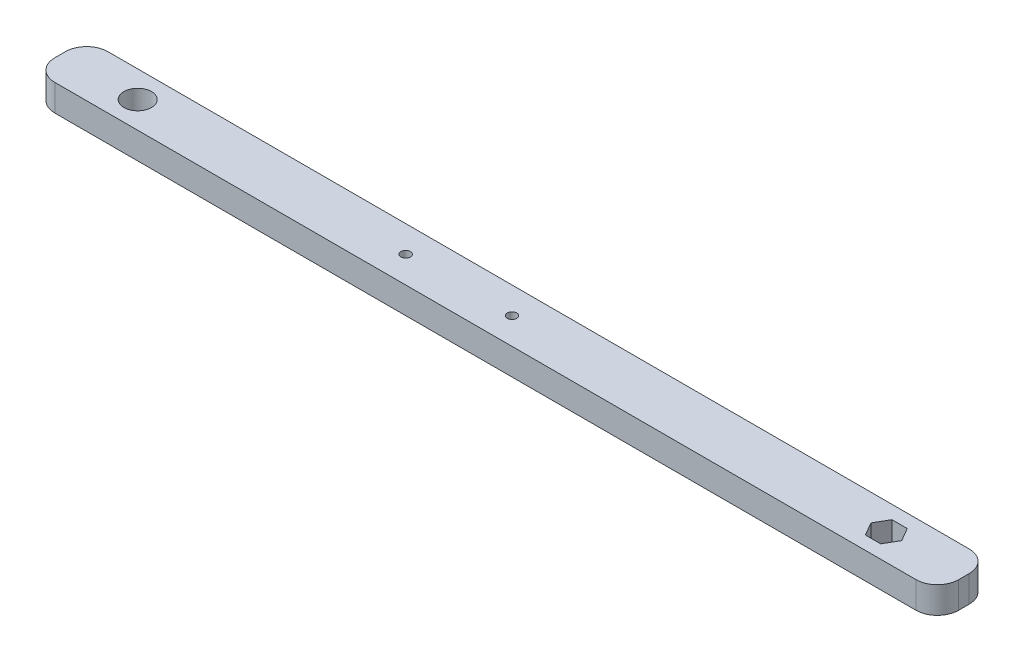
ISO-10303-21;
HEADER;
FILE_DESCRIPTION(('STEP AP214'),'2;1');
FILE_NAME('part.step','',(''),(''),'','','');
FILE_SCHEMA(('AUTOMOTIVE_DESIGN { 1 0 10303 214 1 1 1 1 }'));
ENDSEC;
DATA;
#1=APPLICATION_CONTEXT('core data for automotive mechanical design processes');
#2=APPLICATION_PROTOCOL_DEFINITION('international standard','automotive_design',2000,#1);
#3=PRODUCT_CONTEXT('',#1,'mechanical');
#4=PRODUCT('Part','Part','',(#3));
#5=PRODUCT_RELATED_PRODUCT_CATEGORY('part','',(#4));
#6=PRODUCT_DEFINITION_FORMATION('','',#4);
#7=PRODUCT_DEFINITION_CONTEXT('part definition',#1,'design');
#8=PRODUCT_DEFINITION('design','',#6,#7);
#9=PRODUCT_DEFINITION_SHAPE('','',#8);
#10=(LENGTH_UNIT() NAMED_UNIT(*) SI_UNIT(.MILLI.,.METRE.));
#11=(NAMED_UNIT(*) PLANE_ANGLE_UNIT() SI_UNIT($,.RADIAN.));
#12=(NAMED_UNIT(*) SI_UNIT($,.STERADIAN.) SOLID_ANGLE_UNIT());
#13=UNCERTAINTY_MEASURE_WITH_UNIT(LENGTH_MEASURE(1.E-05),#10,'distance_accuracy_value','');
#14=(GEOMETRIC_REPRESENTATION_CONTEXT(3) GLOBAL_UNCERTAINTY_ASSIGNED_CONTEXT((#13)) GLOBAL_UNIT_ASSIGNED_CONTEXT((#10,
#11,#12)) REPRESENTATION_CONTEXT('',''));
#15=CARTESIAN_POINT('',(0.,0.,0.));
#16=DIRECTION('',(0.,0.,1.));
#17=DIRECTION('',(1.,0.,0.));
#18=AXIS2_PLACEMENT_3D('',#15,#16,#17);
#19=CARTESIAN_POINT('',(0.,6.35,0.));
#20=DIRECTION('',(0.,-1.,0.));
#21=DIRECTION('',(0.,0.,-1.));
#22=AXIS2_PLACEMENT_3D('',#19,#20,#21);
#23=PLANE('',#22);
#24=CARTESIAN_POINT('',(107.95,6.35,-6.35));
#25=DIRECTION('',(0.,1.,0.));
#26=DIRECTION('',(0.,0.,1.));
#27=AXIS2_PLACEMENT_3D('',#24,#25,#26);
#28=CIRCLE('',#27,1.13029999999999);
#29=CARTESIAN_POINT('',(107.95,6.35,-5.21970000000001));
#30=VERTEX_POINT('',#29);
#31=EDGE_CURVE('E263',#30,#30,#28,.T.);
#32=ORIENTED_EDGE('',*,*,#31,.F.);
#33=EDGE_LOOP('',(#32));
#34=FACE_BOUND('',#33,.T.);
#35=CARTESIAN_POINT('',(82.55,6.35,-6.35));
#36=DIRECTION('',(0.,1.,0.));
#37=DIRECTION('',(0.,0.,1.));
#38=AXIS2_PLACEMENT_3D('',#35,#36,#37);
#39=CIRCLE('',#38,1.13029999999999);
#40=CARTESIAN_POINT('',(82.55,6.35,-5.21970000000001));
#41=VERTEX_POINT('',#40);
#42=EDGE_CURVE('E268',#41,#41,#39,.T.);
#43=ORIENTED_EDGE('',*,*,#42,.F.);
#44=EDGE_LOOP('',(#43));
#45=FACE_BOUND('',#44,.T.);
#46=CARTESIAN_POINT('',(18.542,6.35,-6.35));
#47=DIRECTION('',(0.,1.,0.));
#48=DIRECTION('',(0.,0.,1.));
#49=AXIS2_PLACEMENT_3D('',#46,#47,#48);
#50=CIRCLE('',#49,3.302);
#51=CARTESIAN_POINT('',(18.542,6.35,-3.048));
#52=VERTEX_POINT('',#51);
#53=EDGE_CURVE('E206',#52,#52,#50,.T.);
#54=ORIENTED_EDGE('',*,*,#53,.F.);
#55=EDGE_LOOP('',(#54));
#56=FACE_BOUND('',#55,.T.);
#57=DIRECTION('',(0.,0.,-1.));
#58=VECTOR('',#57,1.);
#59=CARTESIAN_POINT('',(215.9,6.35,0.));
#60=LINE('',#59,#58);
#61=CARTESIAN_POINT('',(215.9,6.35,-5.08));
#62=VERTEX_POINT('',#61);
#63=CARTESIAN_POINT('',(215.9,6.35,-7.62));
#64=VERTEX_POINT('',#63);
#65=EDGE_CURVE('E217',#62,#64,#60,.T.);
#66=ORIENTED_EDGE('',*,*,#65,.T.);
#67=CARTESIAN_POINT('',(210.82,6.35,-7.62));
#68=DIRECTION('',(0.,-1.,0.));
#69=DIRECTION('',(0.,0.,-1.));
#70=AXIS2_PLACEMENT_3D('',#67,#68,#69);
#71=CIRCLE('',#70,5.08);
#72=CARTESIAN_POINT('',(210.82,6.35,-12.7));
#73=VERTEX_POINT('',#72);
#74=EDGE_CURVE('E255',#64,#73,#71,.F.);
#75=ORIENTED_EDGE('',*,*,#74,.T.);
#76=DIRECTION('',(-1.,0.,0.));
#77=VECTOR('',#76,1.);
#78=CARTESIAN_POINT('',(0.,6.35,-12.7));
#79=LINE('',#78,#77);
#80=CARTESIAN_POINT('',(5.08,6.35,-12.7));
#81=VERTEX_POINT('',#80);
#82=EDGE_CURVE('E220',#73,#81,#79,.T.);
#83=ORIENTED_EDGE('',*,*,#82,.T.);
#84=CARTESIAN_POINT('',(5.08,6.35,-7.62));
#85=DIRECTION('',(0.,-1.,0.));
#86=DIRECTION('',(0.,0.,-1.));
#87=AXIS2_PLACEMENT_3D('',#84,#85,#86);
#88=CIRCLE('',#87,5.08);
#89=CARTESIAN_POINT('',(0.,6.35,-7.62));
#90=VERTEX_POINT('',#89);
#91=EDGE_CURVE('E251',#81,#90,#88,.F.);
#92=ORIENTED_EDGE('',*,*,#91,.T.);
#93=DIRECTION('',(0.,0.,1.));
#94=VECTOR('',#93,1.);
#95=CARTESIAN_POINT('',(0.,6.35,0.));
#96=LINE('',#95,#94);
#97=CARTESIAN_POINT('',(0.,6.35,-5.08));
#98=VERTEX_POINT('',#97);
#99=EDGE_CURVE('E212',#90,#98,#96,.T.);
#100=ORIENTED_EDGE('',*,*,#99,.T.);
#101=CARTESIAN_POINT('',(5.08,6.35,-5.08));
#102=DIRECTION('',(0.,-1.,0.));
#103=DIRECTION('',(0.,0.,-1.));
#104=AXIS2_PLACEMENT_3D('',#101,#102,#103);
#105=CIRCLE('',#104,5.08);
#106=CARTESIAN_POINT('',(5.08,6.35,0.));
#107=VERTEX_POINT('',#106);
#108=EDGE_CURVE('E67',#98,#107,#105,.F.);
#109=ORIENTED_EDGE('',*,*,#108,.T.);
#110=DIRECTION('',(1.,0.,0.));
#111=VECTOR('',#110,1.);
#112=CARTESIAN_POINT('',(0.,6.35,0.));
#113=LINE('',#112,#111);
#114=CARTESIAN_POINT('',(210.82,6.35,0.));
#115=VERTEX_POINT('',#114);
#116=EDGE_CURVE('E214',#107,#115,#113,.T.);
#117=ORIENTED_EDGE('',*,*,#116,.T.);
#118=CARTESIAN_POINT('',(210.82,6.35,-5.08));
#119=DIRECTION('',(0.,-1.,0.));
#120=DIRECTION('',(0.,0.,-1.));
#121=AXIS2_PLACEMENT_3D('',#118,#119,#120);
#122=CIRCLE('',#121,5.08);
#123=EDGE_CURVE('E253',#115,#62,#122,.F.);
#124=ORIENTED_EDGE('',*,*,#123,.T.);
#125=EDGE_LOOP('',(#66,#75,#83,#92,#100,#109,#117,#124));
#126=FACE_BOUND('',#125,.T.);
#127=DIRECTION('',(-0.499999999999999,0.,-0.866025403784439));
#128=VECTOR('',#127,1.);
#129=CARTESIAN_POINT('',(201.024174209354,6.35,-6.35000000000003));
#130=LINE('',#129,#128);
#131=CARTESIAN_POINT('',(201.024174209354,6.35,-6.35000000000003));
#132=VERTEX_POINT('',#131);
#133=CARTESIAN_POINT('',(199.191087104677,6.35,-9.52500000000003));
#134=VERTEX_POINT('',#133);
#135=EDGE_CURVE('E149',#132,#134,#130,.T.);
#136=ORIENTED_EDGE('',*,*,#135,.F.);
#137=DIRECTION('',(0.499999999999999,0.,-0.866025403784439));
#138=VECTOR('',#137,1.);
#139=CARTESIAN_POINT('',(199.191087104677,6.35,-3.17499999999998));
#140=LINE('',#139,#138);
#141=CARTESIAN_POINT('',(199.191087104677,6.35,-3.17499999999997));
#142=VERTEX_POINT('',#141);
#143=EDGE_CURVE('E182',#142,#132,#140,.T.);
#144=ORIENTED_EDGE('',*,*,#143,.F.);
#145=DIRECTION('',(1.,0.,0.));
#146=VECTOR('',#145,1.);
#147=CARTESIAN_POINT('',(195.524912895323,6.35,-3.17499999999998));
#148=LINE('',#147,#146);
#149=CARTESIAN_POINT('',(195.524912895323,6.35,-3.17499999999998));
#150=VERTEX_POINT('',#149);
#151=EDGE_CURVE('E179',#150,#142,#148,.T.);
#152=ORIENTED_EDGE('',*,*,#151,.F.);
#153=DIRECTION('',(0.499999999999998,0.,0.86602540378444));
#154=VECTOR('',#153,1.);
#155=CARTESIAN_POINT('',(193.691825790646,6.35,-6.34999999999999));
#156=LINE('',#155,#154);
#157=CARTESIAN_POINT('',(193.691825790646,6.35,-6.34999999999999));
#158=VERTEX_POINT('',#157);
#159=EDGE_CURVE('E174',#158,#150,#156,.T.);
#160=ORIENTED_EDGE('',*,*,#159,.F.);
#161=DIRECTION('',(-0.5,0.,0.866025403784439));
#162=VECTOR('',#161,1.);
#163=CARTESIAN_POINT('',(195.524912895323,6.35,-9.52500000000003));
#164=LINE('',#163,#162);
#165=CARTESIAN_POINT('',(195.524912895323,6.35,-9.52500000000003));
#166=VERTEX_POINT('',#165);
#167=EDGE_CURVE('E172',#166,#158,#164,.T.);
#168=ORIENTED_EDGE('',*,*,#167,.F.);
#169=DIRECTION('',(-1.,0.,0.));
#170=VECTOR('',#169,1.);
#171=CARTESIAN_POINT('',(199.191087104677,6.35,-9.52500000000003));
#172=LINE('',#171,#170);
#173=EDGE_CURVE('E159',#134,#166,#172,.T.);
#174=ORIENTED_EDGE('',*,*,#173,.F.);
#175=EDGE_LOOP('',(#136,#144,#152,#160,#168,#174));
#176=FACE_BOUND('',#175,.T.);
#177=ADVANCED_FACE('F43',(#34,#45,#56,#126,#176),#23,.F.);
#178=CARTESIAN_POINT('',(0.,0.,0.));
#179=DIRECTION('',(0.,-1.,0.));
#180=DIRECTION('',(0.,0.,-1.));
#181=AXIS2_PLACEMENT_3D('',#178,#179,#180);
#182=PLANE('',#181);
#183=CARTESIAN_POINT('',(107.95,0.,-6.35));
#184=DIRECTION('',(0.,-1.,0.));
#185=DIRECTION('',(0.,0.,-1.));
#186=AXIS2_PLACEMENT_3D('',#183,#184,#185);
#187=CIRCLE('',#186,1.13029999999999);
#188=CARTESIAN_POINT('',(107.95,0.,-7.48029999999999));
#189=VERTEX_POINT('',#188);
#190=EDGE_CURVE('E47',#189,#189,#187,.T.);
#191=ORIENTED_EDGE('',*,*,#190,.F.);
#192=EDGE_LOOP('',(#191));
#193=FACE_BOUND('',#192,.T.);
#194=CARTESIAN_POINT('',(82.55,0.,-6.35));
#195=DIRECTION('',(0.,-1.,0.));
#196=DIRECTION('',(0.,0.,-1.));
#197=AXIS2_PLACEMENT_3D('',#194,#195,#196);
#198=CIRCLE('',#197,1.13029999999999);
#199=CARTESIAN_POINT('',(82.55,0.,-7.48029999999999));
#200=VERTEX_POINT('',#199);
#201=EDGE_CURVE('E261',#200,#200,#198,.T.);
#202=ORIENTED_EDGE('',*,*,#201,.F.);
#203=EDGE_LOOP('',(#202));
#204=FACE_BOUND('',#203,.T.);
#205=DIRECTION('',(-1.,0.,0.));
#206=VECTOR('',#205,1.);
#207=CARTESIAN_POINT('',(0.,0.,-12.7));
#208=LINE('',#207,#206);
#209=CARTESIAN_POINT('',(210.82,0.,-12.7));
#210=VERTEX_POINT('',#209);
#211=CARTESIAN_POINT('',(5.08,0.,-12.7));
#212=VERTEX_POINT('',#211);
#213=EDGE_CURVE('E215',#210,#212,#208,.T.);
#214=ORIENTED_EDGE('',*,*,#213,.F.);
#215=CARTESIAN_POINT('',(210.82,0.,-7.62));
#216=DIRECTION('',(0.,-1.,0.));
#217=DIRECTION('',(0.,0.,-1.));
#218=AXIS2_PLACEMENT_3D('',#215,#216,#217);
#219=CIRCLE('',#218,5.08);
#220=CARTESIAN_POINT('',(215.9,0.,-7.62));
#221=VERTEX_POINT('',#220);
#222=EDGE_CURVE('E243',#210,#221,#219,.T.);
#223=ORIENTED_EDGE('',*,*,#222,.T.);
#224=DIRECTION('',(0.,0.,-1.));
#225=VECTOR('',#224,1.);
#226=CARTESIAN_POINT('',(215.9,0.,0.));
#227=LINE('',#226,#225);
#228=CARTESIAN_POINT('',(215.9,0.,-5.08));
#229=VERTEX_POINT('',#228);
#230=EDGE_CURVE('E228',#229,#221,#227,.T.);
#231=ORIENTED_EDGE('',*,*,#230,.F.);
#232=CARTESIAN_POINT('',(210.82,0.,-5.08));
#233=DIRECTION('',(0.,-1.,0.));
#234=DIRECTION('',(0.,0.,-1.));
#235=AXIS2_PLACEMENT_3D('',#232,#233,#234);
#236=CIRCLE('',#235,5.08);
#237=CARTESIAN_POINT('',(210.82,0.,0.));
#238=VERTEX_POINT('',#237);
#239=EDGE_CURVE('E241',#229,#238,#236,.T.);
#240=ORIENTED_EDGE('',*,*,#239,.T.);
#241=DIRECTION('',(1.,0.,0.));
#242=VECTOR('',#241,1.);
#243=CARTESIAN_POINT('',(0.,0.,0.));
#244=LINE('',#243,#242);
#245=CARTESIAN_POINT('',(5.08,0.,0.));
#246=VERTEX_POINT('',#245);
#247=EDGE_CURVE('E226',#246,#238,#244,.T.);
#248=ORIENTED_EDGE('',*,*,#247,.F.);
#249=CARTESIAN_POINT('',(5.08,0.,-5.08));
#250=DIRECTION('',(0.,-1.,0.));
#251=DIRECTION('',(0.,0.,-1.));
#252=AXIS2_PLACEMENT_3D('',#249,#250,#251);
#253=CIRCLE('',#252,5.08);
#254=CARTESIAN_POINT('',(0.,0.,-5.08));
#255=VERTEX_POINT('',#254);
#256=EDGE_CURVE('E237',#246,#255,#253,.T.);
#257=ORIENTED_EDGE('',*,*,#256,.T.);
#258=DIRECTION('',(0.,0.,1.));
#259=VECTOR('',#258,1.);
#260=CARTESIAN_POINT('',(0.,0.,0.));
#261=LINE('',#260,#259);
#262=CARTESIAN_POINT('',(0.,0.,-7.62));
#263=VERTEX_POINT('',#262);
#264=EDGE_CURVE('E209',#263,#255,#261,.T.);
#265=ORIENTED_EDGE('',*,*,#264,.F.);
#266=CARTESIAN_POINT('',(5.08,0.,-7.62));
#267=DIRECTION('',(0.,-1.,0.));
#268=DIRECTION('',(0.,0.,-1.));
#269=AXIS2_PLACEMENT_3D('',#266,#267,#268);
#270=CIRCLE('',#269,5.08);
#271=EDGE_CURVE('E239',#263,#212,#270,.T.);
#272=ORIENTED_EDGE('',*,*,#271,.T.);
#273=EDGE_LOOP('',(#214,#223,#231,#240,#248,#257,#265,#272));
#274=FACE_BOUND('',#273,.T.);
#275=CARTESIAN_POINT('',(18.542,0.,-6.35));
#276=DIRECTION('',(0.,1.,0.));
#277=DIRECTION('',(0.,0.,1.));
#278=AXIS2_PLACEMENT_3D('',#275,#276,#277);
#279=CIRCLE('',#278,3.302);
#280=CARTESIAN_POINT('',(18.542,0.,-3.048));
#281=VERTEX_POINT('',#280);
#282=EDGE_CURVE('E167',#281,#281,#279,.T.);
#283=ORIENTED_EDGE('',*,*,#282,.T.);
#284=EDGE_LOOP('',(#283));
#285=FACE_BOUND('',#284,.T.);
#286=DIRECTION('',(0.499999999999999,0.,-0.866025403784439));
#287=VECTOR('',#286,1.);
#288=CARTESIAN_POINT('',(199.191087104677,0.,-3.17499999999998));
#289=LINE('',#288,#287);
#290=CARTESIAN_POINT('',(199.191087104677,0.,-3.17499999999998));
#291=VERTEX_POINT('',#290);
#292=CARTESIAN_POINT('',(201.024174209354,0.,-6.35000000000004));
#293=VERTEX_POINT('',#292);
#294=EDGE_CURVE('E160',#291,#293,#289,.T.);
#295=ORIENTED_EDGE('',*,*,#294,.T.);
#296=DIRECTION('',(-0.499999999999999,0.,-0.866025403784439));
#297=VECTOR('',#296,1.);
#298=CARTESIAN_POINT('',(201.024174209354,0.,-6.35000000000003));
#299=LINE('',#298,#297);
#300=CARTESIAN_POINT('',(199.191087104677,0.,-9.52500000000003));
#301=VERTEX_POINT('',#300);
#302=EDGE_CURVE('E184',#293,#301,#299,.T.);
#303=ORIENTED_EDGE('',*,*,#302,.T.);
#304=DIRECTION('',(-1.,0.,0.));
#305=VECTOR('',#304,1.);
#306=CARTESIAN_POINT('',(199.191087104677,0.,-9.52500000000003));
#307=LINE('',#306,#305);
#308=CARTESIAN_POINT('',(195.524912895323,0.,-9.52500000000003));
#309=VERTEX_POINT('',#308);
#310=EDGE_CURVE('E166',#301,#309,#307,.T.);
#311=ORIENTED_EDGE('',*,*,#310,.T.);
#312=DIRECTION('',(-0.5,0.,0.866025403784439));
#313=VECTOR('',#312,1.);
#314=CARTESIAN_POINT('',(195.524912895323,0.,-9.52500000000003));
#315=LINE('',#314,#313);
#316=CARTESIAN_POINT('',(193.691825790646,0.,-6.34999999999999));
#317=VERTEX_POINT('',#316);
#318=EDGE_CURVE('E187',#309,#317,#315,.T.);
#319=ORIENTED_EDGE('',*,*,#318,.T.);
#320=DIRECTION('',(0.499999999999998,0.,0.86602540378444));
#321=VECTOR('',#320,1.);
#322=CARTESIAN_POINT('',(193.691825790646,0.,-6.34999999999999));
#323=LINE('',#322,#321);
#324=CARTESIAN_POINT('',(195.524912895323,0.,-3.17499999999998));
#325=VERTEX_POINT('',#324);
#326=EDGE_CURVE('E190',#317,#325,#323,.T.);
#327=ORIENTED_EDGE('',*,*,#326,.T.);
#328=DIRECTION('',(1.,0.,0.));
#329=VECTOR('',#328,1.);
#330=CARTESIAN_POINT('',(195.524912895323,0.,-3.17499999999998));
#331=LINE('',#330,#329);
#332=EDGE_CURVE('E193',#325,#291,#331,.T.);
#333=ORIENTED_EDGE('',*,*,#332,.T.);
#334=EDGE_LOOP('',(#295,#303,#311,#319,#327,#333));
#335=FACE_BOUND('',#334,.T.);
#336=ADVANCED_FACE('F279',(#193,#204,#274,#285,#335),#182,.T.);
#337=CARTESIAN_POINT('',(0.,6.35,0.));
#338=DIRECTION('',(1.,0.,0.));
#339=DIRECTION('',(0.,0.,-1.));
#340=AXIS2_PLACEMENT_3D('',#337,#338,#339);
#341=PLANE('',#340);
#342=ORIENTED_EDGE('',*,*,#99,.F.);
#343=DIRECTION('',(0.,-1.,0.));
#344=VECTOR('',#343,1.);
#345=CARTESIAN_POINT('',(0.,6.35,-7.62));
#346=LINE('',#345,#344);
#347=EDGE_CURVE('E11',#90,#263,#346,.T.);
#348=ORIENTED_EDGE('',*,*,#347,.T.);
#349=ORIENTED_EDGE('',*,*,#264,.T.);
#350=DIRECTION('',(0.,-1.,0.));
#351=VECTOR('',#350,1.);
#352=CARTESIAN_POINT('',(0.,6.35,-5.08));
#353=LINE('',#352,#351);
#354=EDGE_CURVE('E52',#255,#98,#353,.F.);
#355=ORIENTED_EDGE('',*,*,#354,.T.);
#356=EDGE_LOOP('',(#342,#348,#349,#355));
#357=FACE_BOUND('',#356,.T.);
#358=ADVANCED_FACE('F307',(#357),#341,.F.);
#359=CARTESIAN_POINT('',(0.,6.35,0.));
#360=DIRECTION('',(0.,0.,-1.));
#361=DIRECTION('',(-1.,0.,0.));
#362=AXIS2_PLACEMENT_3D('',#359,#360,#361);
#363=PLANE('',#362);
#364=ORIENTED_EDGE('',*,*,#247,.T.);
#365=DIRECTION('',(0.,-1.,0.));
#366=VECTOR('',#365,1.);
#367=CARTESIAN_POINT('',(210.82,6.35,0.));
#368=LINE('',#367,#366);
#369=EDGE_CURVE('E60',#238,#115,#368,.F.);
#370=ORIENTED_EDGE('',*,*,#369,.T.);
#371=ORIENTED_EDGE('',*,*,#116,.F.);
#372=DIRECTION('',(0.,-1.,0.));
#373=VECTOR('',#372,1.);
#374=CARTESIAN_POINT('',(5.08,6.35,0.));
#375=LINE('',#374,#373);
#376=EDGE_CURVE('E257',#107,#246,#375,.T.);
#377=ORIENTED_EDGE('',*,*,#376,.T.);
#378=EDGE_LOOP('',(#364,#370,#371,#377));
#379=FACE_BOUND('',#378,.T.);
#380=ADVANCED_FACE('F312',(#379),#363,.F.);
#381=CARTESIAN_POINT('',(215.9,6.35,0.));
#382=DIRECTION('',(-1.,0.,0.));
#383=DIRECTION('',(0.,0.,1.));
#384=AXIS2_PLACEMENT_3D('',#381,#382,#383);
#385=PLANE('',#384);
#386=ORIENTED_EDGE('',*,*,#230,.T.);
#387=DIRECTION('',(0.,-1.,0.));
#388=VECTOR('',#387,1.);
#389=CARTESIAN_POINT('',(215.9,6.35,-7.62));
#390=LINE('',#389,#388);
#391=EDGE_CURVE('E248',#221,#64,#390,.F.);
#392=ORIENTED_EDGE('',*,*,#391,.T.);
#393=ORIENTED_EDGE('',*,*,#65,.F.);
#394=DIRECTION('',(0.,-1.,0.));
#395=VECTOR('',#394,1.);
#396=CARTESIAN_POINT('',(215.9,6.35,-5.08));
#397=LINE('',#396,#395);
#398=EDGE_CURVE('E245',#62,#229,#397,.T.);
#399=ORIENTED_EDGE('',*,*,#398,.T.);
#400=EDGE_LOOP('',(#386,#392,#393,#399));
#401=FACE_BOUND('',#400,.T.);
#402=ADVANCED_FACE('F315',(#401),#385,.F.);
#403=CARTESIAN_POINT('',(0.,6.35,-12.7));
#404=DIRECTION('',(0.,0.,1.));
#405=DIRECTION('',(1.,0.,0.));
#406=AXIS2_PLACEMENT_3D('',#403,#404,#405);
#407=PLANE('',#406);
#408=ORIENTED_EDGE('',*,*,#82,.F.);
#409=DIRECTION('',(0.,-1.,0.));
#410=VECTOR('',#409,1.);
#411=CARTESIAN_POINT('',(210.82,6.35,-12.7));
#412=LINE('',#411,#410);
#413=EDGE_CURVE('E234',#73,#210,#412,.T.);
#414=ORIENTED_EDGE('',*,*,#413,.T.);
#415=ORIENTED_EDGE('',*,*,#213,.T.);
#416=DIRECTION('',(0.,-1.,0.));
#417=VECTOR('',#416,1.);
#418=CARTESIAN_POINT('',(5.08,6.35,-12.7));
#419=LINE('',#418,#417);
#420=EDGE_CURVE('E223',#212,#81,#419,.F.);
#421=ORIENTED_EDGE('',*,*,#420,.T.);
#422=EDGE_LOOP('',(#408,#414,#415,#421));
#423=FACE_BOUND('',#422,.T.);
#424=ADVANCED_FACE('F295',(#423),#407,.F.);
#425=CARTESIAN_POINT('',(18.542,6.35,-6.35));
#426=DIRECTION('',(0.,-1.,0.));
#427=DIRECTION('',(0.,0.,-1.));
#428=AXIS2_PLACEMENT_3D('',#425,#426,#427);
#429=CYLINDRICAL_SURFACE('',#428,3.302);
#430=ORIENTED_EDGE('',*,*,#53,.T.);
#431=EDGE_LOOP('',(#430));
#432=FACE_BOUND('',#431,.T.);
#433=ORIENTED_EDGE('',*,*,#282,.F.);
#434=EDGE_LOOP('',(#433));
#435=FACE_BOUND('',#434,.T.);
#436=ADVANCED_FACE('F322',(#432,#435),#429,.F.);
#437=CARTESIAN_POINT('',(201.024174209354,6.35,-6.35000000000003));
#438=DIRECTION('',(-0.866025403784439,0.,0.499999999999999));
#439=DIRECTION('',(0.499999999999999,0.,0.866025403784439));
#440=AXIS2_PLACEMENT_3D('',#437,#438,#439);
#441=PLANE('',#440);
#442=ORIENTED_EDGE('',*,*,#302,.F.);
#443=DIRECTION('',(0.,-1.,0.));
#444=VECTOR('',#443,1.);
#445=CARTESIAN_POINT('',(201.024174209354,6.35,-6.35000000000003));
#446=LINE('',#445,#444);
#447=EDGE_CURVE('E155',#132,#293,#446,.T.);
#448=ORIENTED_EDGE('',*,*,#447,.F.);
#449=ORIENTED_EDGE('',*,*,#135,.T.);
#450=DIRECTION('',(0.,-1.,0.));
#451=VECTOR('',#450,1.);
#452=CARTESIAN_POINT('',(199.191087104677,6.35,-9.52500000000003));
#453=LINE('',#452,#451);
#454=EDGE_CURVE('E152',#134,#301,#453,.T.);
#455=ORIENTED_EDGE('',*,*,#454,.T.);
#456=EDGE_LOOP('',(#442,#448,#449,#455));
#457=FACE_BOUND('',#456,.T.);
#458=ADVANCED_FACE('F151',(#457),#441,.T.);
#459=CARTESIAN_POINT('',(199.191087104677,6.35,-9.52500000000003));
#460=DIRECTION('',(0.,0.,1.));
#461=DIRECTION('',(1.,0.,0.));
#462=AXIS2_PLACEMENT_3D('',#459,#460,#461);
#463=PLANE('',#462);
#464=ORIENTED_EDGE('',*,*,#310,.F.);
#465=ORIENTED_EDGE('',*,*,#454,.F.);
#466=ORIENTED_EDGE('',*,*,#173,.T.);
#467=DIRECTION('',(0.,-1.,0.));
#468=VECTOR('',#467,1.);
#469=CARTESIAN_POINT('',(195.524912895323,6.35,-9.52500000000003));
#470=LINE('',#469,#468);
#471=EDGE_CURVE('E168',#166,#309,#470,.T.);
#472=ORIENTED_EDGE('',*,*,#471,.T.);
#473=EDGE_LOOP('',(#464,#465,#466,#472));
#474=FACE_BOUND('',#473,.T.);
#475=ADVANCED_FACE('F163',(#474),#463,.T.);
#476=CARTESIAN_POINT('',(195.524912895323,6.35,-9.52500000000003));
#477=DIRECTION('',(0.866025403784439,0.,0.5));
#478=DIRECTION('',(0.5,0.,-0.866025403784439));
#479=AXIS2_PLACEMENT_3D('',#476,#477,#478);
#480=PLANE('',#479);
#481=ORIENTED_EDGE('',*,*,#318,.F.);
#482=ORIENTED_EDGE('',*,*,#471,.F.);
#483=ORIENTED_EDGE('',*,*,#167,.T.);
#484=DIRECTION('',(0.,-1.,0.));
#485=VECTOR('',#484,1.);
#486=CARTESIAN_POINT('',(193.691825790646,6.35,-6.34999999999999));
#487=LINE('',#486,#485);
#488=EDGE_CURVE('E203',#158,#317,#487,.T.);
#489=ORIENTED_EDGE('',*,*,#488,.T.);
#490=EDGE_LOOP('',(#481,#482,#483,#489));
#491=FACE_BOUND('',#490,.T.);
#492=ADVANCED_FACE('F359',(#491),#480,.T.);
#493=CARTESIAN_POINT('',(193.691825790646,6.35,-6.34999999999999));
#494=DIRECTION('',(0.86602540378444,0.,-0.499999999999997));
#495=DIRECTION('',(-0.499999999999998,0.,-0.86602540378444));
#496=AXIS2_PLACEMENT_3D('',#493,#494,#495);
#497=PLANE('',#496);
#498=ORIENTED_EDGE('',*,*,#326,.F.);
#499=ORIENTED_EDGE('',*,*,#488,.F.);
#500=ORIENTED_EDGE('',*,*,#159,.T.);
#501=DIRECTION('',(0.,-1.,0.));
#502=VECTOR('',#501,1.);
#503=CARTESIAN_POINT('',(195.524912895323,6.35,-3.17499999999998));
#504=LINE('',#503,#502);
#505=EDGE_CURVE('E201',#150,#325,#504,.T.);
#506=ORIENTED_EDGE('',*,*,#505,.T.);
#507=EDGE_LOOP('',(#498,#499,#500,#506));
#508=FACE_BOUND('',#507,.T.);
#509=ADVANCED_FACE('F355',(#508),#497,.T.);
#510=CARTESIAN_POINT('',(195.524912895323,6.35,-3.17499999999998));
#511=DIRECTION('',(0.,0.,-1.));
#512=DIRECTION('',(-1.,0.,0.));
#513=AXIS2_PLACEMENT_3D('',#510,#511,#512);
#514=PLANE('',#513);
#515=ORIENTED_EDGE('',*,*,#332,.F.);
#516=ORIENTED_EDGE('',*,*,#505,.F.);
#517=ORIENTED_EDGE('',*,*,#151,.T.);
#518=DIRECTION('',(0.,-1.,0.));
#519=VECTOR('',#518,1.);
#520=CARTESIAN_POINT('',(199.191087104677,6.35,-3.17499999999998));
#521=LINE('',#520,#519);
#522=EDGE_CURVE('E199',#142,#291,#521,.T.);
#523=ORIENTED_EDGE('',*,*,#522,.T.);
#524=EDGE_LOOP('',(#515,#516,#517,#523));
#525=FACE_BOUND('',#524,.T.);
#526=ADVANCED_FACE('F351',(#525),#514,.T.);
#527=CARTESIAN_POINT('',(199.191087104677,6.35,-3.17499999999998));
#528=DIRECTION('',(-0.866025403784439,0.,-0.499999999999999));
#529=DIRECTION('',(-0.499999999999999,0.,0.86602540378444));
#530=AXIS2_PLACEMENT_3D('',#527,#528,#529);
#531=PLANE('',#530);
#532=ORIENTED_EDGE('',*,*,#294,.F.);
#533=ORIENTED_EDGE('',*,*,#522,.F.);
#534=ORIENTED_EDGE('',*,*,#143,.T.);
#535=ORIENTED_EDGE('',*,*,#447,.T.);
#536=EDGE_LOOP('',(#532,#533,#534,#535));
#537=FACE_BOUND('',#536,.T.);
#538=ADVANCED_FACE('F331',(#537),#531,.T.);
#539=CARTESIAN_POINT('',(210.82,6.35,-7.62));
#540=DIRECTION('',(0.,-1.,0.));
#541=DIRECTION('',(0.,0.,-1.));
#542=AXIS2_PLACEMENT_3D('',#539,#540,#541);
#543=CYLINDRICAL_SURFACE('',#542,5.08);
#544=ORIENTED_EDGE('',*,*,#74,.F.);
#545=ORIENTED_EDGE('',*,*,#391,.F.);
#546=ORIENTED_EDGE('',*,*,#222,.F.);
#547=ORIENTED_EDGE('',*,*,#413,.F.);
#548=EDGE_LOOP('',(#544,#545,#546,#547));
#549=FACE_BOUND('',#548,.T.);
#550=ADVANCED_FACE('F292',(#549),#543,.T.);
#551=CARTESIAN_POINT('',(210.82,6.35,-5.08));
#552=DIRECTION('',(0.,-1.,0.));
#553=DIRECTION('',(0.,0.,-1.));
#554=AXIS2_PLACEMENT_3D('',#551,#552,#553);
#555=CYLINDRICAL_SURFACE('',#554,5.08);
#556=ORIENTED_EDGE('',*,*,#123,.F.);
#557=ORIENTED_EDGE('',*,*,#369,.F.);
#558=ORIENTED_EDGE('',*,*,#239,.F.);
#559=ORIENTED_EDGE('',*,*,#398,.F.);
#560=EDGE_LOOP('',(#556,#557,#558,#559));
#561=FACE_BOUND('',#560,.T.);
#562=ADVANCED_FACE('F314',(#561),#555,.T.);
#563=CARTESIAN_POINT('',(5.08,6.35,-7.62));
#564=DIRECTION('',(0.,-1.,0.));
#565=DIRECTION('',(0.,0.,-1.));
#566=AXIS2_PLACEMENT_3D('',#563,#564,#565);
#567=CYLINDRICAL_SURFACE('',#566,5.08);
#568=ORIENTED_EDGE('',*,*,#91,.F.);
#569=ORIENTED_EDGE('',*,*,#420,.F.);
#570=ORIENTED_EDGE('',*,*,#271,.F.);
#571=ORIENTED_EDGE('',*,*,#347,.F.);
#572=EDGE_LOOP('',(#568,#569,#570,#571));
#573=FACE_BOUND('',#572,.T.);
#574=ADVANCED_FACE('F304',(#573),#567,.T.);
#575=CARTESIAN_POINT('',(5.08,6.35,-5.08));
#576=DIRECTION('',(0.,-1.,0.));
#577=DIRECTION('',(0.,0.,-1.));
#578=AXIS2_PLACEMENT_3D('',#575,#576,#577);
#579=CYLINDRICAL_SURFACE('',#578,5.08);
#580=ORIENTED_EDGE('',*,*,#108,.F.);
#581=ORIENTED_EDGE('',*,*,#354,.F.);
#582=ORIENTED_EDGE('',*,*,#256,.F.);
#583=ORIENTED_EDGE('',*,*,#376,.F.);
#584=EDGE_LOOP('',(#580,#581,#582,#583));
#585=FACE_BOUND('',#584,.T.);
#586=ADVANCED_FACE('F45',(#585),#579,.T.);
#587=CARTESIAN_POINT('',(82.55,-15.24,-6.35));
#588=DIRECTION('',(0.,1.,0.));
#589=DIRECTION('',(0.,0.,1.));
#590=AXIS2_PLACEMENT_3D('',#587,#588,#589);
#591=CYLINDRICAL_SURFACE('',#590,1.13029999999999);
#592=ORIENTED_EDGE('',*,*,#201,.T.);
#593=EDGE_LOOP('',(#592));
#594=FACE_BOUND('',#593,.T.);
#595=ORIENTED_EDGE('',*,*,#42,.T.);
#596=EDGE_LOOP('',(#595));
#597=FACE_BOUND('',#596,.T.);
#598=ADVANCED_FACE('F275',(#594,#597),#591,.F.);
#599=CARTESIAN_POINT('',(107.95,-15.24,-6.35));
#600=DIRECTION('',(0.,1.,0.));
#601=DIRECTION('',(0.,0.,1.));
#602=AXIS2_PLACEMENT_3D('',#599,#600,#601);
#603=CYLINDRICAL_SURFACE('',#602,1.13029999999999);
#604=ORIENTED_EDGE('',*,*,#190,.T.);
#605=EDGE_LOOP('',(#604));
#606=FACE_BOUND('',#605,.T.);
#607=ORIENTED_EDGE('',*,*,#31,.T.);
#608=EDGE_LOOP('',(#607));
#609=FACE_BOUND('',#608,.T.);
#610=ADVANCED_FACE('F340',(#606,#609),#603,.F.);
#611=CLOSED_SHELL('',(#177,#336,#358,#380,#402,#424,#436,#458,#475,#492,#509,#526,#538,#550,
#562,#574,#586,#598,#610));
#612=MANIFOLD_SOLID_BREP('B2',#611);
#613=ADVANCED_BREP_SHAPE_REPRESENTATION('',(#18,#612),#14);
#614=SHAPE_DEFINITION_REPRESENTATION(#9,#613);
ENDSEC;
END-ISO-10303-21;
